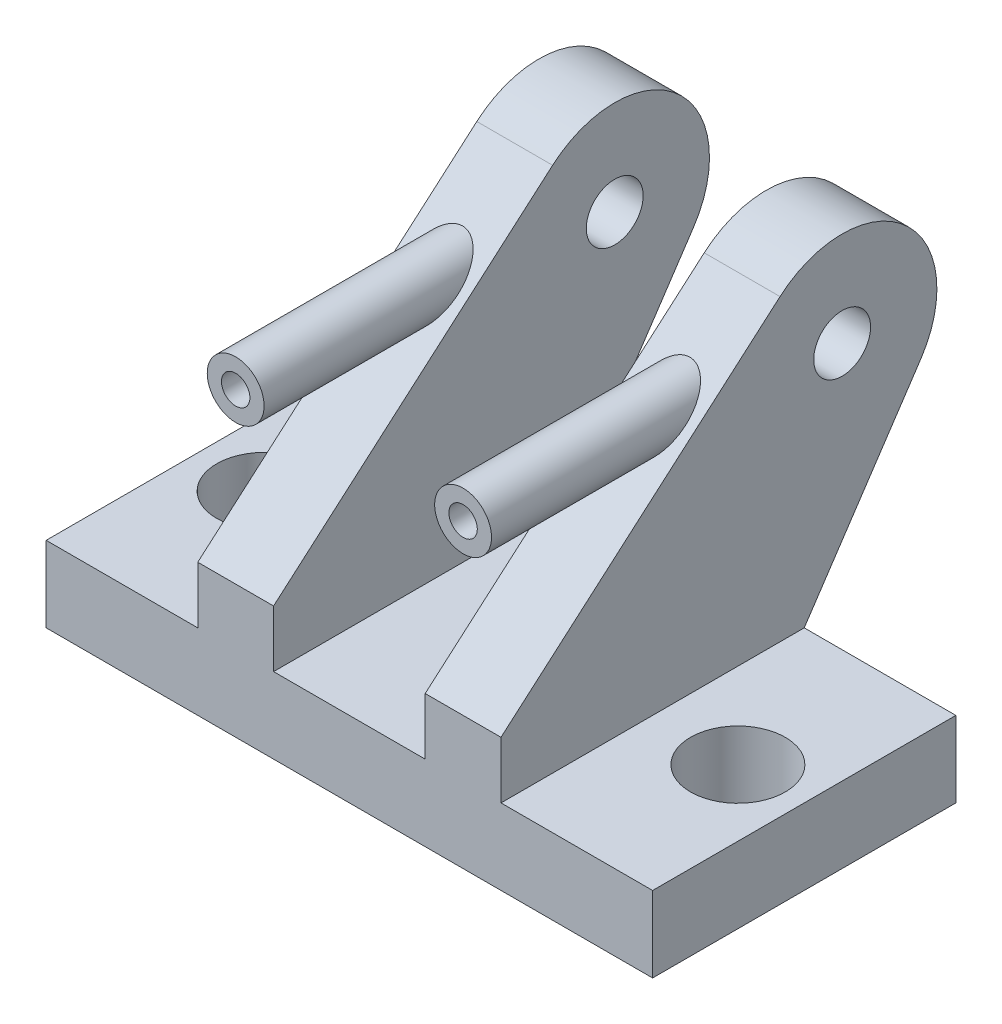
ISO-10303-21;
HEADER;
FILE_DESCRIPTION(('STEP AP214'),'2;1');
FILE_NAME('part.step','',(''),(''),'','','');
FILE_SCHEMA(('AUTOMOTIVE_DESIGN { 1 0 10303 214 1 1 1 1 }'));
ENDSEC;
DATA;
#1=APPLICATION_CONTEXT('core data for automotive mechanical design processes');
#2=APPLICATION_PROTOCOL_DEFINITION('international standard','automotive_design',2000,#1);
#3=PRODUCT_CONTEXT('',#1,'mechanical');
#4=PRODUCT('Part','Part','',(#3));
#5=PRODUCT_RELATED_PRODUCT_CATEGORY('part','',(#4));
#6=PRODUCT_DEFINITION_FORMATION('','',#4);
#7=PRODUCT_DEFINITION_CONTEXT('part definition',#1,'design');
#8=PRODUCT_DEFINITION('design','',#6,#7);
#9=PRODUCT_DEFINITION_SHAPE('','',#8);
#10=(LENGTH_UNIT() NAMED_UNIT(*) SI_UNIT(.MILLI.,.METRE.));
#11=(NAMED_UNIT(*) PLANE_ANGLE_UNIT() SI_UNIT($,.RADIAN.));
#12=(NAMED_UNIT(*) SI_UNIT($,.STERADIAN.) SOLID_ANGLE_UNIT());
#13=UNCERTAINTY_MEASURE_WITH_UNIT(LENGTH_MEASURE(1.E-05),#10,'distance_accuracy_value','');
#14=(GEOMETRIC_REPRESENTATION_CONTEXT(3) GLOBAL_UNCERTAINTY_ASSIGNED_CONTEXT((#13)) GLOBAL_UNIT_ASSIGNED_CONTEXT((#10,
#11,#12)) REPRESENTATION_CONTEXT('',''));
#15=CARTESIAN_POINT('',(0.,0.,0.));
#16=DIRECTION('',(0.,0.,1.));
#17=DIRECTION('',(1.,0.,0.));
#18=AXIS2_PLACEMENT_3D('',#15,#16,#17);
#19=CARTESIAN_POINT('',(-16.,32.,-20.));
#20=DIRECTION('',(1.,0.,0.));
#21=DIRECTION('',(0.,0.,-1.));
#22=AXIS2_PLACEMENT_3D('',#19,#20,#21);
#23=CYLINDRICAL_SURFACE('',#22,3.);
#24=CARTESIAN_POINT('',(-16.,32.,-20.));
#25=DIRECTION('',(1.,0.,0.));
#26=DIRECTION('',(0.,0.,-1.));
#27=AXIS2_PLACEMENT_3D('',#24,#25,#26);
#28=CIRCLE('',#27,3.);
#29=CARTESIAN_POINT('',(-16.,32.,-23.));
#30=VERTEX_POINT('',#29);
#31=EDGE_CURVE('E190',#30,#30,#28,.T.);
#32=ORIENTED_EDGE('',*,*,#31,.F.);
#33=EDGE_LOOP('',(#32));
#34=FACE_BOUND('',#33,.T.);
#35=CARTESIAN_POINT('',(-8.,32.,-20.));
#36=DIRECTION('',(1.,0.,0.));
#37=DIRECTION('',(0.,0.,-1.));
#38=AXIS2_PLACEMENT_3D('',#35,#36,#37);
#39=CIRCLE('',#38,3.);
#40=CARTESIAN_POINT('',(-8.,32.,-23.));
#41=VERTEX_POINT('',#40);
#42=EDGE_CURVE('E288',#41,#41,#39,.T.);
#43=ORIENTED_EDGE('',*,*,#42,.T.);
#44=EDGE_LOOP('',(#43));
#45=FACE_BOUND('',#44,.T.);
#46=CARTESIAN_POINT('',(-10.5,31.7704449033827,-17.0087954838198));
#47=CARTESIAN_POINT('',(-10.5000048111588,31.8478663222095,-17.0028580295699));
#48=CARTESIAN_POINT('',(-10.5060273391963,31.9256007365963,-16.9999427419938));
#49=CARTESIAN_POINT('',(-10.5300670627226,32.0792542082069,-17.0000592171805));
#50=CARTESIAN_POINT('',(-10.5481020623102,32.155170397298,-17.0030998203767));
#51=CARTESIAN_POINT('',(-10.595481887112,32.3027185353823,-17.0143975460524));
#52=CARTESIAN_POINT('',(-10.6247943058734,32.3743620869285,-17.0226397643905));
#53=CARTESIAN_POINT('',(-10.6937531665848,32.5118203804366,-17.043164364668));
#54=CARTESIAN_POINT('',(-10.7333997139456,32.5776350629334,-17.0554467878189));
#55=CARTESIAN_POINT('',(-10.8238857075586,32.7048508174601,-17.0832190609236));
#56=CARTESIAN_POINT('',(-10.8751416069052,32.7659293169323,-17.0988264579663));
#57=CARTESIAN_POINT('',(-10.986505257153,32.8791101689768,-17.1310916451509));
#58=CARTESIAN_POINT('',(-11.0466178866392,32.9312075398989,-17.1477500112916));
#59=CARTESIAN_POINT('',(-11.1793974438675,33.0289828029199,-17.1814767722966));
#60=CARTESIAN_POINT('',(-11.2526739595966,33.0738604978633,-17.1984784174645));
#61=CARTESIAN_POINT('',(-11.4063841024319,33.1506601930828,-17.2291336123782));
#62=CARTESIAN_POINT('',(-11.486815648196,33.182585946049,-17.2427881314642));
#63=CARTESIAN_POINT('',(-11.6505464923198,33.2316053081399,-17.2643364266875));
#64=CARTESIAN_POINT('',(-11.7337177807029,33.2490612430133,-17.2723700890034));
#65=CARTESIAN_POINT('',(-11.9021593481119,33.2696489999433,-17.2818885750492));
#66=CARTESIAN_POINT('',(-11.9874280779958,33.2727910924926,-17.2833780943164));
#67=CARTESIAN_POINT('',(-12.1497859406349,33.2649677334479,-17.2797310432029));
#68=CARTESIAN_POINT('',(-12.2269487290328,33.2551904943836,-17.2751524561731));
#69=CARTESIAN_POINT('',(-12.378402023894,33.223989711037,-17.2609967490716));
#70=CARTESIAN_POINT('',(-12.4526918960177,33.2025636102362,-17.2514185317739));
#71=CARTESIAN_POINT('',(-12.5974211704858,33.1485332051793,-17.2284054097147));
#72=CARTESIAN_POINT('',(-12.6678061246324,33.1158025265947,-17.214927195648));
#73=CARTESIAN_POINT('',(-12.802380189521,33.0401498426781,-17.1857987997305));
#74=CARTESIAN_POINT('',(-12.8665667068665,32.9972235973323,-17.1701477153798));
#75=CARTESIAN_POINT('',(-12.9929458715461,32.8978666193472,-17.1369925351559));
#76=CARTESIAN_POINT('',(-13.0544523693286,32.840573886554,-17.1194475125294));
#77=CARTESIAN_POINT('',(-13.1672692456487,32.716240786258,-17.0860440463706));
#78=CARTESIAN_POINT('',(-13.2185774346183,32.6491983308369,-17.0701859653621));
#79=CARTESIAN_POINT('',(-13.3102817463242,32.5056533965863,-17.0420030055271));
#80=CARTESIAN_POINT('',(-13.3504792863428,32.4290104675863,-17.0297422108769));
#81=CARTESIAN_POINT('',(-13.4172385572043,32.2693498392952,-17.0110386359032));
#82=CARTESIAN_POINT('',(-13.443810637506,32.1863370336231,-17.0045914369284));
#83=CARTESIAN_POINT('',(-13.4806459937187,32.0235834493097,-16.9990780638923));
#84=CARTESIAN_POINT('',(-13.4920527992766,31.9441196254445,-16.9994579860263));
#85=CARTESIAN_POINT('',(-13.5020555795953,31.7846930857811,-17.0066736922358));
#86=CARTESIAN_POINT('',(-13.500654975282,31.7047305089046,-17.0135077519401));
#87=CARTESIAN_POINT('',(-13.4857575032198,31.5509284341147,-17.0328402385209));
#88=CARTESIAN_POINT('',(-13.4728912115522,31.4769863603886,-17.045026793255));
#89=CARTESIAN_POINT('',(-13.4366444018226,31.3327382693359,-17.0742211676912));
#90=CARTESIAN_POINT('',(-13.4132618546571,31.2624329566402,-17.091229917598));
#91=CARTESIAN_POINT('',(-13.3553631467453,31.1231507619428,-17.1300439891382));
#92=CARTESIAN_POINT('',(-13.3203054468814,31.0544595352581,-17.1520616442904));
#93=CARTESIAN_POINT('',(-13.2406359601358,30.9238749551391,-17.1987907584515));
#94=CARTESIAN_POINT('',(-13.1960194802268,30.8619849635373,-17.2235035377356));
#95=CARTESIAN_POINT('',(-13.0925670444801,30.7392017492637,-17.2768831146723));
#96=CARTESIAN_POINT('',(-13.0326857291898,30.6792423151275,-17.3056777223733));
#97=CARTESIAN_POINT('',(-12.9033026718428,30.5699343939376,-17.3620646661374));
#98=CARTESIAN_POINT('',(-12.8337914132717,30.5205965280606,-17.3896557769723));
#99=CARTESIAN_POINT('',(-12.6829952194243,30.4319787876894,-17.4418620732814));
#100=CARTESIAN_POINT('',(-12.601328759867,30.3932320615202,-17.4662947474963));
#101=CARTESIAN_POINT('',(-12.4306103307609,30.3307264558074,-17.5070212480425));
#102=CARTESIAN_POINT('',(-12.3415753345912,30.3069341595524,-17.523333203586));
#103=CARTESIAN_POINT('',(-12.172230909427,30.2782538371052,-17.5432029577608));
#104=CARTESIAN_POINT('',(-12.0924703527432,30.2711665974273,-17.5482392918356));
#105=CARTESIAN_POINT('',(-11.9327993759373,30.2698296360846,-17.5491804754195));
#106=CARTESIAN_POINT('',(-11.8528890452951,30.2755738012185,-17.5450896733251));
#107=CARTESIAN_POINT('',(-11.7060355434161,30.2979010058189,-17.529574442924));
#108=CARTESIAN_POINT('',(-11.6387460638112,30.3129956330201,-17.5191604567186));
#109=CARTESIAN_POINT('',(-11.5077807127443,30.3518581068206,-17.4931748168069));
#110=CARTESIAN_POINT('',(-11.4441061007414,30.3756289551382,-17.4776013782536));
#111=CARTESIAN_POINT('',(-11.3157334770773,30.433587163924,-17.4411678334928));
#112=CARTESIAN_POINT('',(-11.2514807977881,30.4685319538828,-17.41995304452));
#113=CARTESIAN_POINT('',(-11.1293034092184,30.5468598381189,-17.3750384208283));
#114=CARTESIAN_POINT('',(-11.0713823946924,30.5902478186836,-17.3513371507985));
#115=CARTESIAN_POINT('',(-10.9531938223681,30.6927995414072,-17.2990601660759));
#116=CARTESIAN_POINT('',(-10.894221079432,30.7533923590554,-17.2703444155389));
#117=CARTESIAN_POINT('',(-10.7869452211249,30.8840767702519,-17.2143633994414));
#118=CARTESIAN_POINT('',(-10.7386515161409,30.9541766543937,-17.1870994291243));
#119=CARTESIAN_POINT('',(-10.6522948300558,31.1058846200196,-17.1351677931162));
#120=CARTESIAN_POINT('',(-10.6147781453822,31.1878643222564,-17.1106680617289));
#121=CARTESIAN_POINT('',(-10.5548354706436,31.3585843484694,-17.06806155791));
#122=CARTESIAN_POINT('',(-10.5323648467104,31.4473037993593,-17.0499359533889));
#123=CARTESIAN_POINT('',(-10.512135222407,31.5761013815226,-17.029843660117));
#124=CARTESIAN_POINT('',(-10.5075987946117,31.6147057655227,-17.0245880386588));
#125=CARTESIAN_POINT('',(-10.5015298347631,31.6923284354203,-17.0155631040996));
#126=CARTESIAN_POINT('',(-10.4999975703444,31.7313467578835,-17.0117939234463));
#127=CARTESIAN_POINT('',(-10.5,31.7704449033827,-17.0087954838198));
#128=B_SPLINE_CURVE_WITH_KNOTS('',3,(#46,#47,#48,#49,#50,#51,#52,#53,#54,#55,#56,#57,#58,#59,
#60,#61,#62,#63,#64,#65,#66,#67,#68,#69,#70,#71,#72,#73,#74,#75,#76,#77,#78,#79,#80,#81,#82,#83,
#84,#85,#86,#87,#88,#89,#90,#91,#92,#93,#94,#95,#96,#97,#98,#99,#100,#101,#102,#103,#104,#105,
#106,#107,#108,#109,#110,#111,#112,#113,#114,#115,#116,#117,#118,#119,#120,#121,#122,#123,#124,
#125,#126,#127),.UNSPECIFIED.,.T.,.F.,(4,2,2,2,2,2,2,2,2,2,2,2,2,2,2,2,2,2,2,2,2,2,2,2,2,2,2,2,
2,2,2,2,2,2,2,2,2,2,2,2,4),(0.,0.232792148926327,0.465930097182229,0.698403051534686,
0.930878377261991,1.17360439246079,1.41646461267079,1.67797478655208,1.93940913638484,
2.19408048271189,2.44856906801057,2.68120534821702,2.91389270458821,3.14927030892275,
3.38474597128177,3.64118377025843,3.89767656687815,4.15849424666069,4.41911352321119,
4.6586908595553,4.89820420541347,5.12530623089295,5.3524520943483,5.59208892620943,
5.83184368211594,6.09918070021873,6.36678381639534,6.6460699034179,6.92472966659668,
7.16394454301338,7.40304547580341,7.61140703170697,7.81984074304264,8.04746094171442,
8.27521326381293,8.54194259056401,8.80890603120849,9.08766465130132,9.36559263142858,
9.48314318400097,9.60070420842717),.UNSPECIFIED.);
#129=CARTESIAN_POINT('',(-10.5,31.7704449033827,-17.0087954838198));
#130=VERTEX_POINT('',#129);
#131=EDGE_CURVE('E269',#130,#130,#128,.T.);
#132=ORIENTED_EDGE('',*,*,#131,.T.);
#133=EDGE_LOOP('',(#132));
#134=FACE_BOUND('',#133,.T.);
#135=ADVANCED_FACE('F45',(#34,#45,#134),#23,.F.);
#136=CARTESIAN_POINT('',(0.,8.,0.));
#137=DIRECTION('',(0.,1.,0.));
#138=DIRECTION('',(0.,0.,1.));
#139=AXIS2_PLACEMENT_3D('',#136,#137,#138);
#140=PLANE('',#139);
#141=CARTESIAN_POINT('',(-25.,8.,0.));
#142=DIRECTION('',(0.,1.,0.));
#143=DIRECTION('',(0.,0.,1.));
#144=AXIS2_PLACEMENT_3D('',#141,#142,#143);
#145=CIRCLE('',#144,5.);
#146=CARTESIAN_POINT('',(-25.,8.,5.));
#147=VERTEX_POINT('',#146);
#148=EDGE_CURVE('E278',#147,#147,#145,.F.);
#149=ORIENTED_EDGE('',*,*,#148,.T.);
#150=EDGE_LOOP('',(#149));
#151=FACE_BOUND('',#150,.T.);
#152=DIRECTION('',(1.,0.,0.));
#153=VECTOR('',#152,1.);
#154=CARTESIAN_POINT('',(-32.,8.,16.));
#155=LINE('',#154,#153);
#156=CARTESIAN_POINT('',(-32.,8.,16.));
#157=VERTEX_POINT('',#156);
#158=CARTESIAN_POINT('',(-16.,8.,16.));
#159=VERTEX_POINT('',#158);
#160=EDGE_CURVE('E353',#157,#159,#155,.T.);
#161=ORIENTED_EDGE('',*,*,#160,.T.);
#162=DIRECTION('',(0.,0.,-1.));
#163=VECTOR('',#162,1.);
#164=CARTESIAN_POINT('',(-16.,8.,-16.));
#165=LINE('',#164,#163);
#166=CARTESIAN_POINT('',(-16.,8.,-16.));
#167=VERTEX_POINT('',#166);
#168=EDGE_CURVE('E63',#159,#167,#165,.T.);
#169=ORIENTED_EDGE('',*,*,#168,.T.);
#170=DIRECTION('',(-1.,0.,0.));
#171=VECTOR('',#170,1.);
#172=CARTESIAN_POINT('',(-32.,8.,-16.));
#173=LINE('',#172,#171);
#174=CARTESIAN_POINT('',(-32.,8.,-16.));
#175=VERTEX_POINT('',#174);
#176=EDGE_CURVE('E401',#167,#175,#173,.T.);
#177=ORIENTED_EDGE('',*,*,#176,.T.);
#178=DIRECTION('',(0.,0.,1.));
#179=VECTOR('',#178,1.);
#180=CARTESIAN_POINT('',(-32.,8.,-16.));
#181=LINE('',#180,#179);
#182=EDGE_CURVE('E351',#175,#157,#181,.T.);
#183=ORIENTED_EDGE('',*,*,#182,.T.);
#184=EDGE_LOOP('',(#161,#169,#177,#183));
#185=FACE_BOUND('',#184,.T.);
#186=ADVANCED_FACE('F251',(#151,#185),#140,.T.);
#187=DIRECTION('',(0.,0.,-1.));
#188=VECTOR('',#187,1.);
#189=CARTESIAN_POINT('',(-8.,8.,-16.));
#190=LINE('',#189,#188);
#191=CARTESIAN_POINT('',(-8.,8.,16.));
#192=VERTEX_POINT('',#191);
#193=CARTESIAN_POINT('',(-8.,8.,-16.));
#194=VERTEX_POINT('',#193);
#195=EDGE_CURVE('E186',#192,#194,#190,.T.);
#196=ORIENTED_EDGE('',*,*,#195,.F.);
#197=CARTESIAN_POINT('',(8.,8.,16.));
#198=VERTEX_POINT('',#197);
#199=EDGE_CURVE('E350',#192,#198,#155,.T.);
#200=ORIENTED_EDGE('',*,*,#199,.T.);
#201=DIRECTION('',(0.,0.,-1.));
#202=VECTOR('',#201,1.);
#203=CARTESIAN_POINT('',(8.,8.,-16.));
#204=LINE('',#203,#202);
#205=CARTESIAN_POINT('',(8.,8.,-16.));
#206=VERTEX_POINT('',#205);
#207=EDGE_CURVE('E370',#198,#206,#204,.T.);
#208=ORIENTED_EDGE('',*,*,#207,.T.);
#209=EDGE_CURVE('E405',#206,#194,#173,.T.);
#210=ORIENTED_EDGE('',*,*,#209,.T.);
#211=EDGE_LOOP('',(#196,#200,#208,#210));
#212=FACE_BOUND('',#211,.T.);
#213=ADVANCED_FACE('F328',(#212),#140,.T.);
#214=CARTESIAN_POINT('',(32.,8.,-16.));
#215=DIRECTION('',(-1.,0.,0.));
#216=DIRECTION('',(0.,0.,1.));
#217=AXIS2_PLACEMENT_3D('',#214,#215,#216);
#218=PLANE('',#217);
#219=DIRECTION('',(0.,0.,-1.));
#220=VECTOR('',#219,1.);
#221=CARTESIAN_POINT('',(32.,0.,-16.));
#222=LINE('',#221,#220);
#223=CARTESIAN_POINT('',(32.,0.,16.));
#224=VERTEX_POINT('',#223);
#225=CARTESIAN_POINT('',(32.,0.,-16.));
#226=VERTEX_POINT('',#225);
#227=EDGE_CURVE('E397',#224,#226,#222,.T.);
#228=ORIENTED_EDGE('',*,*,#227,.T.);
#229=DIRECTION('',(0.,-1.,0.));
#230=VECTOR('',#229,1.);
#231=CARTESIAN_POINT('',(32.,8.,-16.));
#232=LINE('',#231,#230);
#233=CARTESIAN_POINT('',(32.,8.,-16.));
#234=VERTEX_POINT('',#233);
#235=EDGE_CURVE('E11',#234,#226,#232,.T.);
#236=ORIENTED_EDGE('',*,*,#235,.F.);
#237=DIRECTION('',(0.,0.,-1.));
#238=VECTOR('',#237,1.);
#239=CARTESIAN_POINT('',(32.,8.,-16.));
#240=LINE('',#239,#238);
#241=CARTESIAN_POINT('',(32.,8.,16.));
#242=VERTEX_POINT('',#241);
#243=EDGE_CURVE('E398',#242,#234,#240,.T.);
#244=ORIENTED_EDGE('',*,*,#243,.F.);
#245=DIRECTION('',(0.,-1.,0.));
#246=VECTOR('',#245,1.);
#247=CARTESIAN_POINT('',(32.,8.,16.));
#248=LINE('',#247,#246);
#249=EDGE_CURVE('E347',#242,#224,#248,.T.);
#250=ORIENTED_EDGE('',*,*,#249,.T.);
#251=EDGE_LOOP('',(#228,#236,#244,#250));
#252=FACE_BOUND('',#251,.T.);
#253=ADVANCED_FACE('F47',(#252),#218,.F.);
#254=CARTESIAN_POINT('',(-32.,8.,-16.));
#255=DIRECTION('',(0.,0.,1.));
#256=DIRECTION('',(1.,0.,0.));
#257=AXIS2_PLACEMENT_3D('',#254,#255,#256);
#258=PLANE('',#257);
#259=DIRECTION('',(-1.,0.,0.));
#260=VECTOR('',#259,1.);
#261=CARTESIAN_POINT('',(-32.,0.,-16.));
#262=LINE('',#261,#260);
#263=CARTESIAN_POINT('',(-32.,0.,-16.));
#264=VERTEX_POINT('',#263);
#265=EDGE_CURVE('E412',#226,#264,#262,.T.);
#266=ORIENTED_EDGE('',*,*,#265,.T.);
#267=DIRECTION('',(0.,-1.,0.));
#268=VECTOR('',#267,1.);
#269=CARTESIAN_POINT('',(-32.,8.,-16.));
#270=LINE('',#269,#268);
#271=EDGE_CURVE('E55',#175,#264,#270,.T.);
#272=ORIENTED_EDGE('',*,*,#271,.F.);
#273=ORIENTED_EDGE('',*,*,#176,.F.);
#274=DIRECTION('',(1.,0.,0.));
#275=VECTOR('',#274,1.);
#276=CARTESIAN_POINT('',(-16.,8.,-16.));
#277=LINE('',#276,#275);
#278=EDGE_CURVE('E70',#167,#194,#277,.T.);
#279=ORIENTED_EDGE('',*,*,#278,.T.);
#280=ORIENTED_EDGE('',*,*,#209,.F.);
#281=DIRECTION('',(-1.,0.,0.));
#282=VECTOR('',#281,1.);
#283=CARTESIAN_POINT('',(16.,8.,-16.));
#284=LINE('',#283,#282);
#285=CARTESIAN_POINT('',(16.,8.,-16.));
#286=VERTEX_POINT('',#285);
#287=EDGE_CURVE('E393',#286,#206,#284,.T.);
#288=ORIENTED_EDGE('',*,*,#287,.F.);
#289=EDGE_CURVE('E335',#234,#286,#173,.T.);
#290=ORIENTED_EDGE('',*,*,#289,.F.);
#291=ORIENTED_EDGE('',*,*,#235,.T.);
#292=EDGE_LOOP('',(#266,#272,#273,#279,#280,#288,#290,#291));
#293=FACE_BOUND('',#292,.T.);
#294=ADVANCED_FACE('F439',(#293),#258,.F.);
#295=CARTESIAN_POINT('',(-32.,8.,-16.));
#296=DIRECTION('',(1.,0.,0.));
#297=DIRECTION('',(0.,0.,-1.));
#298=AXIS2_PLACEMENT_3D('',#295,#296,#297);
#299=PLANE('',#298);
#300=DIRECTION('',(0.,0.,1.));
#301=VECTOR('',#300,1.);
#302=CARTESIAN_POINT('',(-32.,0.,-16.));
#303=LINE('',#302,#301);
#304=CARTESIAN_POINT('',(-32.,0.,16.));
#305=VERTEX_POINT('',#304);
#306=EDGE_CURVE('E415',#264,#305,#303,.T.);
#307=ORIENTED_EDGE('',*,*,#306,.T.);
#308=DIRECTION('',(0.,-1.,0.));
#309=VECTOR('',#308,1.);
#310=CARTESIAN_POINT('',(-32.,8.,16.));
#311=LINE('',#310,#309);
#312=EDGE_CURVE('E422',#157,#305,#311,.T.);
#313=ORIENTED_EDGE('',*,*,#312,.F.);
#314=ORIENTED_EDGE('',*,*,#182,.F.);
#315=ORIENTED_EDGE('',*,*,#271,.T.);
#316=EDGE_LOOP('',(#307,#313,#314,#315));
#317=FACE_BOUND('',#316,.T.);
#318=ADVANCED_FACE('F432',(#317),#299,.F.);
#319=CARTESIAN_POINT('',(-32.,8.,16.));
#320=DIRECTION('',(0.,0.,-1.));
#321=DIRECTION('',(-1.,0.,0.));
#322=AXIS2_PLACEMENT_3D('',#319,#320,#321);
#323=PLANE('',#322);
#324=DIRECTION('',(1.,0.,0.));
#325=VECTOR('',#324,1.);
#326=CARTESIAN_POINT('',(-32.,0.,16.));
#327=LINE('',#326,#325);
#328=EDGE_CURVE('E402',#305,#224,#327,.T.);
#329=ORIENTED_EDGE('',*,*,#328,.T.);
#330=ORIENTED_EDGE('',*,*,#249,.F.);
#331=CARTESIAN_POINT('',(16.,8.,16.));
#332=VERTEX_POINT('',#331);
#333=EDGE_CURVE('E333',#332,#242,#155,.T.);
#334=ORIENTED_EDGE('',*,*,#333,.F.);
#335=DIRECTION('',(0.,-1.,0.));
#336=VECTOR('',#335,1.);
#337=CARTESIAN_POINT('',(16.,8.,16.));
#338=LINE('',#337,#336);
#339=CARTESIAN_POINT('',(16.,14.,16.));
#340=VERTEX_POINT('',#339);
#341=EDGE_CURVE('E345',#340,#332,#338,.T.);
#342=ORIENTED_EDGE('',*,*,#341,.F.);
#343=DIRECTION('',(-1.,0.,0.));
#344=VECTOR('',#343,1.);
#345=CARTESIAN_POINT('',(16.,14.,16.));
#346=LINE('',#345,#344);
#347=CARTESIAN_POINT('',(8.,14.,16.));
#348=VERTEX_POINT('',#347);
#349=EDGE_CURVE('E360',#340,#348,#346,.T.);
#350=ORIENTED_EDGE('',*,*,#349,.T.);
#351=DIRECTION('',(0.,-1.,0.));
#352=VECTOR('',#351,1.);
#353=CARTESIAN_POINT('',(8.,8.,16.));
#354=LINE('',#353,#352);
#355=EDGE_CURVE('E341',#348,#198,#354,.T.);
#356=ORIENTED_EDGE('',*,*,#355,.T.);
#357=ORIENTED_EDGE('',*,*,#199,.F.);
#358=DIRECTION('',(0.,-1.,0.));
#359=VECTOR('',#358,1.);
#360=CARTESIAN_POINT('',(-8.,8.,16.));
#361=LINE('',#360,#359);
#362=CARTESIAN_POINT('',(-8.,14.,16.));
#363=VERTEX_POINT('',#362);
#364=EDGE_CURVE('E156',#363,#192,#361,.T.);
#365=ORIENTED_EDGE('',*,*,#364,.F.);
#366=DIRECTION('',(1.,0.,0.));
#367=VECTOR('',#366,1.);
#368=CARTESIAN_POINT('',(-16.,14.,16.));
#369=LINE('',#368,#367);
#370=CARTESIAN_POINT('',(-16.,14.,16.));
#371=VERTEX_POINT('',#370);
#372=EDGE_CURVE('E150',#371,#363,#369,.T.);
#373=ORIENTED_EDGE('',*,*,#372,.F.);
#374=DIRECTION('',(0.,-1.,0.));
#375=VECTOR('',#374,1.);
#376=CARTESIAN_POINT('',(-16.,8.,16.));
#377=LINE('',#376,#375);
#378=EDGE_CURVE('E154',#371,#159,#377,.T.);
#379=ORIENTED_EDGE('',*,*,#378,.T.);
#380=ORIENTED_EDGE('',*,*,#160,.F.);
#381=ORIENTED_EDGE('',*,*,#312,.T.);
#382=EDGE_LOOP('',(#329,#330,#334,#342,#350,#356,#357,#365,#373,#379,#380,#381));
#383=FACE_BOUND('',#382,.T.);
#384=ADVANCED_FACE('F152',(#383),#323,.F.);
#385=CARTESIAN_POINT('',(25.,8.,0.));
#386=DIRECTION('',(0.,1.,0.));
#387=DIRECTION('',(0.,0.,1.));
#388=AXIS2_PLACEMENT_3D('',#385,#386,#387);
#389=CIRCLE('',#388,5.);
#390=CARTESIAN_POINT('',(25.,8.,5.));
#391=VERTEX_POINT('',#390);
#392=EDGE_CURVE('E303',#391,#391,#389,.T.);
#393=ORIENTED_EDGE('',*,*,#392,.F.);
#394=EDGE_LOOP('',(#393));
#395=FACE_BOUND('',#394,.T.);
#396=DIRECTION('',(0.,0.,-1.));
#397=VECTOR('',#396,1.);
#398=CARTESIAN_POINT('',(16.,8.,-16.));
#399=LINE('',#398,#397);
#400=EDGE_CURVE('E330',#332,#286,#399,.T.);
#401=ORIENTED_EDGE('',*,*,#400,.F.);
#402=ORIENTED_EDGE('',*,*,#333,.T.);
#403=ORIENTED_EDGE('',*,*,#243,.T.);
#404=ORIENTED_EDGE('',*,*,#289,.T.);
#405=EDGE_LOOP('',(#401,#402,#403,#404));
#406=FACE_BOUND('',#405,.T.);
#407=ADVANCED_FACE('F324',(#395,#406),#140,.T.);
#408=CARTESIAN_POINT('',(0.,0.,0.));
#409=DIRECTION('',(0.,1.,0.));
#410=DIRECTION('',(0.,0.,1.));
#411=AXIS2_PLACEMENT_3D('',#408,#409,#410);
#412=PLANE('',#411);
#413=CARTESIAN_POINT('',(25.,0.,0.));
#414=DIRECTION('',(0.,1.,0.));
#415=DIRECTION('',(0.,0.,1.));
#416=AXIS2_PLACEMENT_3D('',#413,#414,#415);
#417=CIRCLE('',#416,5.);
#418=CARTESIAN_POINT('',(25.,0.,5.));
#419=VERTEX_POINT('',#418);
#420=EDGE_CURVE('E49',#419,#419,#417,.T.);
#421=ORIENTED_EDGE('',*,*,#420,.T.);
#422=EDGE_LOOP('',(#421));
#423=FACE_BOUND('',#422,.T.);
#424=CARTESIAN_POINT('',(-25.,0.,0.));
#425=DIRECTION('',(0.,1.,0.));
#426=DIRECTION('',(0.,0.,1.));
#427=AXIS2_PLACEMENT_3D('',#424,#425,#426);
#428=CIRCLE('',#427,5.);
#429=CARTESIAN_POINT('',(-25.,0.,5.));
#430=VERTEX_POINT('',#429);
#431=EDGE_CURVE('E300',#430,#430,#428,.F.);
#432=ORIENTED_EDGE('',*,*,#431,.F.);
#433=EDGE_LOOP('',(#432));
#434=FACE_BOUND('',#433,.T.);
#435=ORIENTED_EDGE('',*,*,#227,.F.);
#436=ORIENTED_EDGE('',*,*,#328,.F.);
#437=ORIENTED_EDGE('',*,*,#306,.F.);
#438=ORIENTED_EDGE('',*,*,#265,.F.);
#439=EDGE_LOOP('',(#435,#436,#437,#438));
#440=FACE_BOUND('',#439,.T.);
#441=ADVANCED_FACE('F310',(#423,#434,#440),#412,.F.);
#442=CARTESIAN_POINT('',(16.,32.,-20.));
#443=DIRECTION('',(-1.,0.,0.));
#444=DIRECTION('',(0.,0.,1.));
#445=AXIS2_PLACEMENT_3D('',#442,#443,#444);
#446=PLANE('',#445);
#447=ORIENTED_EDGE('',*,*,#400,.T.);
#448=DIRECTION('',(0.,0.831665122141305,-0.555277520356883));
#449=VECTOR('',#448,1.);
#450=CARTESIAN_POINT('',(16.,26.4472247964312,-28.316651221413));
#451=LINE('',#450,#449);
#452=CARTESIAN_POINT('',(16.,26.4472247964312,-28.316651221413));
#453=VERTEX_POINT('',#452);
#454=EDGE_CURVE('E340',#286,#453,#451,.T.);
#455=ORIENTED_EDGE('',*,*,#454,.T.);
#456=CARTESIAN_POINT('',(16.,32.,-20.));
#457=DIRECTION('',(1.,0.,0.));
#458=DIRECTION('',(0.,0.,1.));
#459=AXIS2_PLACEMENT_3D('',#456,#457,#458);
#460=CIRCLE('',#459,10.);
#461=CARTESIAN_POINT('',(16.,39.5527060842746,-13.4458691800849));
#462=VERTEX_POINT('',#461);
#463=EDGE_CURVE('E366',#453,#462,#460,.T.);
#464=ORIENTED_EDGE('',*,*,#463,.T.);
#465=DIRECTION('',(0.,-0.65541308199151,0.755270608427463));
#466=VECTOR('',#465,1.);
#467=CARTESIAN_POINT('',(16.,14.,16.));
#468=LINE('',#467,#466);
#469=EDGE_CURVE('E357',#462,#340,#468,.T.);
#470=ORIENTED_EDGE('',*,*,#469,.T.);
#471=ORIENTED_EDGE('',*,*,#341,.T.);
#472=EDGE_LOOP('',(#447,#455,#464,#470,#471));
#473=FACE_BOUND('',#472,.T.);
#474=CARTESIAN_POINT('',(16.,32.,-20.));
#475=DIRECTION('',(1.,0.,0.));
#476=DIRECTION('',(0.,0.,-1.));
#477=AXIS2_PLACEMENT_3D('',#474,#475,#476);
#478=CIRCLE('',#477,3.);
#479=CARTESIAN_POINT('',(16.,32.,-23.));
#480=VERTEX_POINT('',#479);
#481=EDGE_CURVE('E374',#480,#480,#478,.T.);
#482=ORIENTED_EDGE('',*,*,#481,.F.);
#483=EDGE_LOOP('',(#482));
#484=FACE_BOUND('',#483,.T.);
#485=ADVANCED_FACE('F354',(#473,#484),#446,.F.);
#486=CARTESIAN_POINT('',(8.,32.,-20.));
#487=DIRECTION('',(-1.,0.,0.));
#488=DIRECTION('',(0.,0.,1.));
#489=AXIS2_PLACEMENT_3D('',#486,#487,#488);
#490=PLANE('',#489);
#491=ORIENTED_EDGE('',*,*,#207,.F.);
#492=ORIENTED_EDGE('',*,*,#355,.F.);
#493=DIRECTION('',(0.,-0.65541308199151,0.755270608427463));
#494=VECTOR('',#493,1.);
#495=CARTESIAN_POINT('',(8.,14.,16.));
#496=LINE('',#495,#494);
#497=CARTESIAN_POINT('',(8.,39.5527060842746,-13.4458691800849));
#498=VERTEX_POINT('',#497);
#499=EDGE_CURVE('E380',#498,#348,#496,.T.);
#500=ORIENTED_EDGE('',*,*,#499,.F.);
#501=CARTESIAN_POINT('',(8.,32.,-20.));
#502=DIRECTION('',(1.,0.,0.));
#503=DIRECTION('',(0.,0.,1.));
#504=AXIS2_PLACEMENT_3D('',#501,#502,#503);
#505=CIRCLE('',#504,10.);
#506=CARTESIAN_POINT('',(8.,26.4472247964312,-28.316651221413));
#507=VERTEX_POINT('',#506);
#508=EDGE_CURVE('E377',#507,#498,#505,.T.);
#509=ORIENTED_EDGE('',*,*,#508,.F.);
#510=DIRECTION('',(0.,0.831665122141305,-0.555277520356883));
#511=VECTOR('',#510,1.);
#512=CARTESIAN_POINT('',(8.,26.4472247964312,-28.316651221413));
#513=LINE('',#512,#511);
#514=EDGE_CURVE('E373',#206,#507,#513,.T.);
#515=ORIENTED_EDGE('',*,*,#514,.F.);
#516=EDGE_LOOP('',(#491,#492,#500,#509,#515));
#517=FACE_BOUND('',#516,.T.);
#518=CARTESIAN_POINT('',(8.,32.,-20.));
#519=DIRECTION('',(1.,0.,0.));
#520=DIRECTION('',(0.,0.,-1.));
#521=AXIS2_PLACEMENT_3D('',#518,#519,#520);
#522=CIRCLE('',#521,3.);
#523=CARTESIAN_POINT('',(8.,32.,-23.));
#524=VERTEX_POINT('',#523);
#525=EDGE_CURVE('E450',#524,#524,#522,.T.);
#526=ORIENTED_EDGE('',*,*,#525,.T.);
#527=EDGE_LOOP('',(#526));
#528=FACE_BOUND('',#527,.T.);
#529=ADVANCED_FACE('F485',(#517,#528),#490,.T.);
#530=CARTESIAN_POINT('',(16.,26.4472247964312,-28.316651221413));
#531=DIRECTION('',(0.,0.555277520356883,0.831665122141305));
#532=DIRECTION('',(0.,-0.831665122141305,0.555277520356883));
#533=AXIS2_PLACEMENT_3D('',#530,#531,#532);
#534=PLANE('',#533);
#535=ORIENTED_EDGE('',*,*,#514,.T.);
#536=DIRECTION('',(-1.,0.,0.));
#537=VECTOR('',#536,1.);
#538=CARTESIAN_POINT('',(16.,26.4472247964312,-28.316651221413));
#539=LINE('',#538,#537);
#540=EDGE_CURVE('E389',#453,#507,#539,.T.);
#541=ORIENTED_EDGE('',*,*,#540,.F.);
#542=ORIENTED_EDGE('',*,*,#454,.F.);
#543=ORIENTED_EDGE('',*,*,#287,.T.);
#544=EDGE_LOOP('',(#535,#541,#542,#543));
#545=FACE_BOUND('',#544,.T.);
#546=ADVANCED_FACE('F444',(#545),#534,.F.);
#547=CARTESIAN_POINT('',(16.,32.,-20.));
#548=DIRECTION('',(-1.,0.,0.));
#549=DIRECTION('',(0.,0.,1.));
#550=AXIS2_PLACEMENT_3D('',#547,#548,#549);
#551=CYLINDRICAL_SURFACE('',#550,10.);
#552=ORIENTED_EDGE('',*,*,#508,.T.);
#553=DIRECTION('',(-1.,0.,0.));
#554=VECTOR('',#553,1.);
#555=CARTESIAN_POINT('',(16.,39.5527060842746,-13.4458691800849));
#556=LINE('',#555,#554);
#557=EDGE_CURVE('E364',#462,#498,#556,.T.);
#558=ORIENTED_EDGE('',*,*,#557,.F.);
#559=ORIENTED_EDGE('',*,*,#463,.F.);
#560=ORIENTED_EDGE('',*,*,#540,.T.);
#561=EDGE_LOOP('',(#552,#558,#559,#560));
#562=FACE_BOUND('',#561,.T.);
#563=ADVANCED_FACE('F490',(#562),#551,.T.);
#564=CARTESIAN_POINT('',(16.,14.,16.));
#565=DIRECTION('',(0.,-0.755270608427463,-0.65541308199151));
#566=DIRECTION('',(0.,0.65541308199151,-0.755270608427463));
#567=AXIS2_PLACEMENT_3D('',#564,#565,#566);
#568=PLANE('',#567);
#569=CARTESIAN_POINT('',(12.,31.7704449033827,-4.47791706174467));
#570=DIRECTION('',(0.,-0.755270608427463,-0.65541308199151));
#571=DIRECTION('',(0.,-0.65541308199151,0.755270608427463));
#572=AXIS2_PLACEMENT_3D('',#569,#570,#571);
#573=ELLIPSE('',#572,4.5772659753515,3.);
#574=CARTESIAN_POINT('',(12.,28.7704449033827,-1.02084260360662));
#575=VERTEX_POINT('',#574);
#576=EDGE_CURVE('E454',#575,#575,#573,.F.);
#577=ORIENTED_EDGE('',*,*,#576,.F.);
#578=EDGE_LOOP('',(#577));
#579=FACE_BOUND('',#578,.T.);
#580=ORIENTED_EDGE('',*,*,#499,.T.);
#581=ORIENTED_EDGE('',*,*,#349,.F.);
#582=ORIENTED_EDGE('',*,*,#469,.F.);
#583=ORIENTED_EDGE('',*,*,#557,.T.);
#584=EDGE_LOOP('',(#580,#581,#582,#583));
#585=FACE_BOUND('',#584,.T.);
#586=ADVANCED_FACE('F481',(#579,#585),#568,.F.);
#587=CARTESIAN_POINT('',(16.,32.,-20.));
#588=DIRECTION('',(-1.,0.,0.));
#589=DIRECTION('',(0.,0.,1.));
#590=AXIS2_PLACEMENT_3D('',#587,#588,#589);
#591=CYLINDRICAL_SURFACE('',#590,3.);
#592=CARTESIAN_POINT('',(13.5,31.7704449033827,-17.0087954838198));
#593=CARTESIAN_POINT('',(13.4999951888412,31.8478663222095,-17.0028580295699));
#594=CARTESIAN_POINT('',(13.4939726608037,31.9256007365963,-16.9999427419938));
#595=CARTESIAN_POINT('',(13.4699329372774,32.0792542082069,-17.0000592171805));
#596=CARTESIAN_POINT('',(13.4518979376898,32.155170397298,-17.0030998203767));
#597=CARTESIAN_POINT('',(13.404518112888,32.3027185353823,-17.0143975460524));
#598=CARTESIAN_POINT('',(13.3752056941266,32.3743620869285,-17.0226397643905));
#599=CARTESIAN_POINT('',(13.3062468334152,32.5118203804366,-17.043164364668));
#600=CARTESIAN_POINT('',(13.2666002860544,32.5776350629334,-17.0554467878189));
#601=CARTESIAN_POINT('',(13.1761142924414,32.7048508174601,-17.0832190609236));
#602=CARTESIAN_POINT('',(13.1248583930948,32.7659293169323,-17.0988264579663));
#603=CARTESIAN_POINT('',(13.013494742847,32.8791101689768,-17.1310916451509));
#604=CARTESIAN_POINT('',(12.9533821133608,32.9312075398989,-17.1477500112916));
#605=CARTESIAN_POINT('',(12.8206025561325,33.0289828029199,-17.1814767722966));
#606=CARTESIAN_POINT('',(12.7473260404034,33.0738604978633,-17.1984784174645));
#607=CARTESIAN_POINT('',(12.5936158975681,33.1506601930828,-17.2291336123782));
#608=CARTESIAN_POINT('',(12.513184351804,33.182585946049,-17.2427881314642));
#609=CARTESIAN_POINT('',(12.3494535076802,33.2316053081399,-17.2643364266875));
#610=CARTESIAN_POINT('',(12.2662822192971,33.2490612430133,-17.2723700890034));
#611=CARTESIAN_POINT('',(12.0978406518881,33.2696489999433,-17.2818885750492));
#612=CARTESIAN_POINT('',(12.0125719220042,33.2727910924926,-17.2833780943164));
#613=CARTESIAN_POINT('',(11.8502140593651,33.2649677334479,-17.2797310432029));
#614=CARTESIAN_POINT('',(11.7730512709672,33.2551904943836,-17.2751524561731));
#615=CARTESIAN_POINT('',(11.621597976106,33.223989711037,-17.2609967490716));
#616=CARTESIAN_POINT('',(11.5473081039823,33.2025636102362,-17.2514185317739));
#617=CARTESIAN_POINT('',(11.4025788295142,33.1485332051793,-17.2284054097147));
#618=CARTESIAN_POINT('',(11.3321938753676,33.1158025265947,-17.214927195648));
#619=CARTESIAN_POINT('',(11.197619810479,33.0401498426781,-17.1857987997305));
#620=CARTESIAN_POINT('',(11.1334332931335,32.9972235973323,-17.1701477153798));
#621=CARTESIAN_POINT('',(11.0070541284539,32.8978666193472,-17.1369925351559));
#622=CARTESIAN_POINT('',(10.9455476306714,32.840573886554,-17.1194475125294));
#623=CARTESIAN_POINT('',(10.8327307543513,32.716240786258,-17.0860440463706));
#624=CARTESIAN_POINT('',(10.7814225653817,32.6491983308369,-17.0701859653621));
#625=CARTESIAN_POINT('',(10.6897182536758,32.5056533965863,-17.0420030055271));
#626=CARTESIAN_POINT('',(10.6495207136572,32.4290104675863,-17.0297422108769));
#627=CARTESIAN_POINT('',(10.5827614427957,32.2693498392952,-17.0110386359032));
#628=CARTESIAN_POINT('',(10.556189362494,32.1863370336231,-17.0045914369284));
#629=CARTESIAN_POINT('',(10.5193540062813,32.0235834493097,-16.9990780638923));
#630=CARTESIAN_POINT('',(10.5079472007234,31.9441196254445,-16.9994579860263));
#631=CARTESIAN_POINT('',(10.4979444204047,31.7846930857811,-17.0066736922358));
#632=CARTESIAN_POINT('',(10.499345024718,31.7047305089046,-17.0135077519401));
#633=CARTESIAN_POINT('',(10.5142424967802,31.5509284341147,-17.0328402385209));
#634=CARTESIAN_POINT('',(10.5271087884478,31.4769863603886,-17.045026793255));
#635=CARTESIAN_POINT('',(10.5633555981774,31.3327382693359,-17.0742211676912));
#636=CARTESIAN_POINT('',(10.5867381453429,31.2624329566402,-17.091229917598));
#637=CARTESIAN_POINT('',(10.6446368532547,31.1231507619428,-17.1300439891382));
#638=CARTESIAN_POINT('',(10.6796945531186,31.0544595352581,-17.1520616442904));
#639=CARTESIAN_POINT('',(10.7593640398642,30.9238749551391,-17.1987907584515));
#640=CARTESIAN_POINT('',(10.8039805197732,30.8619849635373,-17.2235035377356));
#641=CARTESIAN_POINT('',(10.9074329555199,30.7392017492637,-17.2768831146723));
#642=CARTESIAN_POINT('',(10.9673142708102,30.6792423151275,-17.3056777223733));
#643=CARTESIAN_POINT('',(11.0966973281572,30.5699343939376,-17.3620646661374));
#644=CARTESIAN_POINT('',(11.1662085867283,30.5205965280606,-17.3896557769723));
#645=CARTESIAN_POINT('',(11.3170047805757,30.4319787876894,-17.4418620732814));
#646=CARTESIAN_POINT('',(11.398671240133,30.3932320615202,-17.4662947474963));
#647=CARTESIAN_POINT('',(11.5693896692391,30.3307264558074,-17.5070212480425));
#648=CARTESIAN_POINT('',(11.6584246654088,30.3069341595524,-17.523333203586));
#649=CARTESIAN_POINT('',(11.827769090573,30.2782538371052,-17.5432029577608));
#650=CARTESIAN_POINT('',(11.9075296472568,30.2711665974273,-17.5482392918356));
#651=CARTESIAN_POINT('',(12.0672006240627,30.2698296360846,-17.5491804754195));
#652=CARTESIAN_POINT('',(12.1471109547049,30.2755738012185,-17.5450896733251));
#653=CARTESIAN_POINT('',(12.2939644565839,30.2979010058189,-17.529574442924));
#654=CARTESIAN_POINT('',(12.3612539361888,30.3129956330201,-17.5191604567186));
#655=CARTESIAN_POINT('',(12.4922192872557,30.3518581068206,-17.4931748168069));
#656=CARTESIAN_POINT('',(12.5558938992586,30.3756289551382,-17.4776013782536));
#657=CARTESIAN_POINT('',(12.6842665229227,30.433587163924,-17.4411678334928));
#658=CARTESIAN_POINT('',(12.7485192022119,30.4685319538828,-17.41995304452));
#659=CARTESIAN_POINT('',(12.8706965907816,30.5468598381189,-17.3750384208283));
#660=CARTESIAN_POINT('',(12.9286176053076,30.5902478186836,-17.3513371507985));
#661=CARTESIAN_POINT('',(13.0468061776319,30.6927995414072,-17.2990601660759));
#662=CARTESIAN_POINT('',(13.105778920568,30.7533923590554,-17.2703444155389));
#663=CARTESIAN_POINT('',(13.2130547788751,30.8840767702519,-17.2143633994414));
#664=CARTESIAN_POINT('',(13.2613484838591,30.9541766543937,-17.1870994291243));
#665=CARTESIAN_POINT('',(13.3477051699442,31.1058846200196,-17.1351677931162));
#666=CARTESIAN_POINT('',(13.3852218546178,31.1878643222564,-17.1106680617289));
#667=CARTESIAN_POINT('',(13.4451645293564,31.3585843484694,-17.06806155791));
#668=CARTESIAN_POINT('',(13.4676351532896,31.4473037993593,-17.0499359533889));
#669=CARTESIAN_POINT('',(13.487864777593,31.5761013815226,-17.029843660117));
#670=CARTESIAN_POINT('',(13.4924012053883,31.6147057655227,-17.0245880386588));
#671=CARTESIAN_POINT('',(13.4984701652369,31.6923284354203,-17.0155631040996));
#672=CARTESIAN_POINT('',(13.5000024296556,31.7313467578835,-17.0117939234463));
#673=CARTESIAN_POINT('',(13.5,31.7704449033827,-17.0087954838198));
#674=B_SPLINE_CURVE_WITH_KNOTS('',3,(#592,#593,#594,#595,#596,#597,#598,#599,#600,#601,#602,
#603,#604,#605,#606,#607,#608,#609,#610,#611,#612,#613,#614,#615,#616,#617,#618,#619,#620,#621,
#622,#623,#624,#625,#626,#627,#628,#629,#630,#631,#632,#633,#634,#635,#636,#637,#638,#639,#640,
#641,#642,#643,#644,#645,#646,#647,#648,#649,#650,#651,#652,#653,#654,#655,#656,#657,#658,#659,
#660,#661,#662,#663,#664,#665,#666,#667,#668,#669,#670,#671,#672,#673),.UNSPECIFIED.,.T.,.F.,(4,
2,2,2,2,2,2,2,2,2,2,2,2,2,2,2,2,2,2,2,2,2,2,2,2,2,2,2,2,2,2,2,2,2,2,2,2,2,2,2,4),(0.,
0.232792148926327,0.465930097182229,0.698403051534686,0.930878377261991,1.17360439246079,
1.41646461267079,1.67797478655209,1.93940913638484,2.19408048271189,2.44856906801057,
2.68120534821702,2.91389270458821,3.14927030892275,3.38474597128177,3.64118377025843,
3.89767656687815,4.15849424666069,4.41911352321119,4.6586908595553,4.89820420541347,
5.12530623089295,5.3524520943483,5.59208892620943,5.83184368211594,6.09918070021873,
6.36678381639534,6.64606990341791,6.92472966659668,7.16394454301338,7.40304547580341,
7.61140703170698,7.81984074304265,8.04746094171442,8.27521326381293,8.54194259056401,
8.80890603120849,9.08766465130132,9.36559263142858,9.48314318400097,9.60070420842717),.UNSPECIFIED.);
#675=CARTESIAN_POINT('',(13.5,31.7704449033827,-17.0087954838198));
#676=VERTEX_POINT('',#675);
#677=EDGE_CURVE('E162',#676,#676,#674,.T.);
#678=ORIENTED_EDGE('',*,*,#677,.T.);
#679=EDGE_LOOP('',(#678));
#680=FACE_BOUND('',#679,.T.);
#681=ORIENTED_EDGE('',*,*,#481,.T.);
#682=EDGE_LOOP('',(#681));
#683=FACE_BOUND('',#682,.T.);
#684=ORIENTED_EDGE('',*,*,#525,.F.);
#685=EDGE_LOOP('',(#684));
#686=FACE_BOUND('',#685,.T.);
#687=ADVANCED_FACE('F477',(#680,#683,#686),#591,.F.);
#688=CARTESIAN_POINT('',(12.,31.7704449033827,16.));
#689=DIRECTION('',(0.,0.,1.));
#690=DIRECTION('',(1.,0.,0.));
#691=AXIS2_PLACEMENT_3D('',#688,#689,#690);
#692=PLANE('',#691);
#693=CARTESIAN_POINT('',(12.,31.7704449033827,16.));
#694=DIRECTION('',(0.,0.,1.));
#695=DIRECTION('',(1.,0.,0.));
#696=AXIS2_PLACEMENT_3D('',#693,#694,#695);
#697=CIRCLE('',#696,1.5);
#698=CARTESIAN_POINT('',(13.5,31.7704449033827,16.));
#699=VERTEX_POINT('',#698);
#700=EDGE_CURVE('E211',#699,#699,#697,.T.);
#701=ORIENTED_EDGE('',*,*,#700,.F.);
#702=EDGE_LOOP('',(#701));
#703=FACE_BOUND('',#702,.T.);
#704=CARTESIAN_POINT('',(12.,31.7704449033827,16.));
#705=DIRECTION('',(0.,0.,1.));
#706=DIRECTION('',(1.,0.,0.));
#707=AXIS2_PLACEMENT_3D('',#704,#705,#706);
#708=CIRCLE('',#707,3.);
#709=CARTESIAN_POINT('',(15.,31.7704449033827,16.));
#710=VERTEX_POINT('',#709);
#711=EDGE_CURVE('E215',#710,#710,#708,.T.);
#712=ORIENTED_EDGE('',*,*,#711,.T.);
#713=EDGE_LOOP('',(#712));
#714=FACE_BOUND('',#713,.T.);
#715=ADVANCED_FACE('F465',(#703,#714),#692,.T.);
#716=CARTESIAN_POINT('',(12.,31.7704449033827,-15.193789369795));
#717=DIRECTION('',(0.,0.,1.));
#718=DIRECTION('',(1.,0.,0.));
#719=AXIS2_PLACEMENT_3D('',#716,#717,#718);
#720=CYLINDRICAL_SURFACE('',#719,3.);
#721=ORIENTED_EDGE('',*,*,#711,.F.);
#722=EDGE_LOOP('',(#721));
#723=FACE_BOUND('',#722,.T.);
#724=ORIENTED_EDGE('',*,*,#576,.T.);
#725=EDGE_LOOP('',(#724));
#726=FACE_BOUND('',#725,.T.);
#727=ADVANCED_FACE('F467',(#723,#726),#720,.T.);
#728=CARTESIAN_POINT('',(12.,31.7704449033827,-30.001));
#729=DIRECTION('',(0.,0.,1.));
#730=DIRECTION('',(1.,0.,0.));
#731=AXIS2_PLACEMENT_3D('',#728,#729,#730);
#732=CYLINDRICAL_SURFACE('',#731,1.5);
#733=ORIENTED_EDGE('',*,*,#677,.F.);
#734=EDGE_LOOP('',(#733));
#735=FACE_BOUND('',#734,.T.);
#736=ORIENTED_EDGE('',*,*,#700,.T.);
#737=EDGE_LOOP('',(#736));
#738=FACE_BOUND('',#737,.T.);
#739=ADVANCED_FACE('F225',(#735,#738),#732,.F.);
#740=CARTESIAN_POINT('',(-16.,14.,16.));
#741=DIRECTION('',(0.,0.755270608427463,0.65541308199151));
#742=DIRECTION('',(0.,-0.65541308199151,0.755270608427463));
#743=AXIS2_PLACEMENT_3D('',#740,#741,#742);
#744=PLANE('',#743);
#745=CARTESIAN_POINT('',(-12.,31.7704449033827,-4.47791706174467));
#746=DIRECTION('',(0.,-0.755270608427463,-0.65541308199151));
#747=DIRECTION('',(0.,-0.65541308199151,0.755270608427463));
#748=AXIS2_PLACEMENT_3D('',#745,#746,#747);
#749=ELLIPSE('',#748,4.5772659753515,3.);
#750=CARTESIAN_POINT('',(-12.,28.7704449033827,-1.02084260360662));
#751=VERTEX_POINT('',#750);
#752=EDGE_CURVE('E284',#751,#751,#749,.T.);
#753=ORIENTED_EDGE('',*,*,#752,.T.);
#754=EDGE_LOOP('',(#753));
#755=FACE_BOUND('',#754,.T.);
#756=DIRECTION('',(0.,-0.65541308199151,0.755270608427463));
#757=VECTOR('',#756,1.);
#758=CARTESIAN_POINT('',(-8.,14.,16.));
#759=LINE('',#758,#757);
#760=CARTESIAN_POINT('',(-8.,39.5527060842746,-13.4458691800849));
#761=VERTEX_POINT('',#760);
#762=EDGE_CURVE('E193',#761,#363,#759,.T.);
#763=ORIENTED_EDGE('',*,*,#762,.F.);
#764=DIRECTION('',(1.,0.,0.));
#765=VECTOR('',#764,1.);
#766=CARTESIAN_POINT('',(-16.,39.5527060842746,-13.4458691800849));
#767=LINE('',#766,#765);
#768=CARTESIAN_POINT('',(-16.,39.5527060842746,-13.4458691800849));
#769=VERTEX_POINT('',#768);
#770=EDGE_CURVE('E163',#769,#761,#767,.T.);
#771=ORIENTED_EDGE('',*,*,#770,.F.);
#772=DIRECTION('',(0.,-0.65541308199151,0.755270608427463));
#773=VECTOR('',#772,1.);
#774=CARTESIAN_POINT('',(-16.,14.,16.));
#775=LINE('',#774,#773);
#776=EDGE_CURVE('E169',#769,#371,#775,.T.);
#777=ORIENTED_EDGE('',*,*,#776,.T.);
#778=ORIENTED_EDGE('',*,*,#372,.T.);
#779=EDGE_LOOP('',(#763,#771,#777,#778));
#780=FACE_BOUND('',#779,.T.);
#781=ADVANCED_FACE('F174',(#755,#780),#744,.T.);
#782=CARTESIAN_POINT('',(-16.,32.,-20.));
#783=DIRECTION('',(1.,0.,0.));
#784=DIRECTION('',(0.,0.,-1.));
#785=AXIS2_PLACEMENT_3D('',#782,#783,#784);
#786=CYLINDRICAL_SURFACE('',#785,10.);
#787=CARTESIAN_POINT('',(-8.,32.,-20.));
#788=DIRECTION('',(1.,0.,0.));
#789=DIRECTION('',(0.,0.,1.));
#790=AXIS2_PLACEMENT_3D('',#787,#788,#789);
#791=CIRCLE('',#790,10.);
#792=CARTESIAN_POINT('',(-8.,26.4472247964312,-28.316651221413));
#793=VERTEX_POINT('',#792);
#794=EDGE_CURVE('E196',#793,#761,#791,.T.);
#795=ORIENTED_EDGE('',*,*,#794,.F.);
#796=DIRECTION('',(1.,0.,0.));
#797=VECTOR('',#796,1.);
#798=CARTESIAN_POINT('',(-16.,26.4472247964312,-28.316651221413));
#799=LINE('',#798,#797);
#800=CARTESIAN_POINT('',(-16.,26.4472247964312,-28.316651221413));
#801=VERTEX_POINT('',#800);
#802=EDGE_CURVE('E206',#801,#793,#799,.T.);
#803=ORIENTED_EDGE('',*,*,#802,.F.);
#804=CARTESIAN_POINT('',(-16.,32.,-20.));
#805=DIRECTION('',(1.,0.,0.));
#806=DIRECTION('',(0.,0.,1.));
#807=AXIS2_PLACEMENT_3D('',#804,#805,#806);
#808=CIRCLE('',#807,10.);
#809=EDGE_CURVE('E176',#801,#769,#808,.T.);
#810=ORIENTED_EDGE('',*,*,#809,.T.);
#811=ORIENTED_EDGE('',*,*,#770,.T.);
#812=EDGE_LOOP('',(#795,#803,#810,#811));
#813=FACE_BOUND('',#812,.T.);
#814=ADVANCED_FACE('F232',(#813),#786,.T.);
#815=CARTESIAN_POINT('',(-16.,26.4472247964312,-28.316651221413));
#816=DIRECTION('',(0.,-0.555277520356883,-0.831665122141305));
#817=DIRECTION('',(0.,0.831665122141305,-0.555277520356883));
#818=AXIS2_PLACEMENT_3D('',#815,#816,#817);
#819=PLANE('',#818);
#820=DIRECTION('',(0.,0.831665122141305,-0.555277520356883));
#821=VECTOR('',#820,1.);
#822=CARTESIAN_POINT('',(-8.,26.4472247964312,-28.316651221413));
#823=LINE('',#822,#821);
#824=EDGE_CURVE('E200',#194,#793,#823,.T.);
#825=ORIENTED_EDGE('',*,*,#824,.F.);
#826=ORIENTED_EDGE('',*,*,#278,.F.);
#827=DIRECTION('',(0.,0.831665122141305,-0.555277520356883));
#828=VECTOR('',#827,1.);
#829=CARTESIAN_POINT('',(-16.,26.4472247964312,-28.316651221413));
#830=LINE('',#829,#828);
#831=EDGE_CURVE('E179',#167,#801,#830,.T.);
#832=ORIENTED_EDGE('',*,*,#831,.T.);
#833=ORIENTED_EDGE('',*,*,#802,.T.);
#834=EDGE_LOOP('',(#825,#826,#832,#833));
#835=FACE_BOUND('',#834,.T.);
#836=ADVANCED_FACE('F236',(#835),#819,.T.);
#837=CARTESIAN_POINT('',(-16.,32.,-20.));
#838=DIRECTION('',(1.,0.,0.));
#839=DIRECTION('',(0.,0.,1.));
#840=AXIS2_PLACEMENT_3D('',#837,#838,#839);
#841=PLANE('',#840);
#842=ORIENTED_EDGE('',*,*,#31,.T.);
#843=EDGE_LOOP('',(#842));
#844=FACE_BOUND('',#843,.T.);
#845=ORIENTED_EDGE('',*,*,#168,.F.);
#846=ORIENTED_EDGE('',*,*,#378,.F.);
#847=ORIENTED_EDGE('',*,*,#776,.F.);
#848=ORIENTED_EDGE('',*,*,#809,.F.);
#849=ORIENTED_EDGE('',*,*,#831,.F.);
#850=EDGE_LOOP('',(#845,#846,#847,#848,#849));
#851=FACE_BOUND('',#850,.T.);
#852=ADVANCED_FACE('F167',(#844,#851),#841,.F.);
#853=CARTESIAN_POINT('',(-8.,32.,-20.));
#854=DIRECTION('',(1.,0.,0.));
#855=DIRECTION('',(0.,0.,1.));
#856=AXIS2_PLACEMENT_3D('',#853,#854,#855);
#857=PLANE('',#856);
#858=ORIENTED_EDGE('',*,*,#42,.F.);
#859=EDGE_LOOP('',(#858));
#860=FACE_BOUND('',#859,.T.);
#861=ORIENTED_EDGE('',*,*,#195,.T.);
#862=ORIENTED_EDGE('',*,*,#824,.T.);
#863=ORIENTED_EDGE('',*,*,#794,.T.);
#864=ORIENTED_EDGE('',*,*,#762,.T.);
#865=ORIENTED_EDGE('',*,*,#364,.T.);
#866=EDGE_LOOP('',(#861,#862,#863,#864,#865));
#867=FACE_BOUND('',#866,.T.);
#868=ADVANCED_FACE('F241',(#860,#867),#857,.T.);
#869=CARTESIAN_POINT('',(-12.,31.7704449033827,-15.193789369795));
#870=DIRECTION('',(0.,0.,1.));
#871=DIRECTION('',(1.,0.,0.));
#872=AXIS2_PLACEMENT_3D('',#869,#870,#871);
#873=CYLINDRICAL_SURFACE('',#872,3.);
#874=CARTESIAN_POINT('',(-12.,31.7704449033827,16.));
#875=DIRECTION('',(0.,0.,-1.));
#876=DIRECTION('',(-1.,0.,0.));
#877=AXIS2_PLACEMENT_3D('',#874,#875,#876);
#878=CIRCLE('',#877,3.);
#879=CARTESIAN_POINT('',(-15.,31.7704449033827,16.));
#880=VERTEX_POINT('',#879);
#881=EDGE_CURVE('E280',#880,#880,#878,.T.);
#882=ORIENTED_EDGE('',*,*,#881,.T.);
#883=EDGE_LOOP('',(#882));
#884=FACE_BOUND('',#883,.T.);
#885=ORIENTED_EDGE('',*,*,#752,.F.);
#886=EDGE_LOOP('',(#885));
#887=FACE_BOUND('',#886,.T.);
#888=ADVANCED_FACE('F244',(#884,#887),#873,.T.);
#889=CARTESIAN_POINT('',(-12.,31.7704449033827,16.));
#890=DIRECTION('',(0.,0.,1.));
#891=DIRECTION('',(-1.,0.,0.));
#892=AXIS2_PLACEMENT_3D('',#889,#890,#891);
#893=PLANE('',#892);
#894=CARTESIAN_POINT('',(-12.,31.7704449033827,16.));
#895=DIRECTION('',(0.,0.,-1.));
#896=DIRECTION('',(-1.,0.,0.));
#897=AXIS2_PLACEMENT_3D('',#894,#895,#896);
#898=CIRCLE('',#897,1.5);
#899=CARTESIAN_POINT('',(-13.5,31.7704449033827,16.));
#900=VERTEX_POINT('',#899);
#901=EDGE_CURVE('E277',#900,#900,#898,.T.);
#902=ORIENTED_EDGE('',*,*,#901,.T.);
#903=EDGE_LOOP('',(#902));
#904=FACE_BOUND('',#903,.T.);
#905=ORIENTED_EDGE('',*,*,#881,.F.);
#906=EDGE_LOOP('',(#905));
#907=FACE_BOUND('',#906,.T.);
#908=ADVANCED_FACE('F255',(#904,#907),#893,.T.);
#909=CARTESIAN_POINT('',(-12.,31.7704449033827,-30.001));
#910=DIRECTION('',(0.,0.,1.));
#911=DIRECTION('',(1.,0.,0.));
#912=AXIS2_PLACEMENT_3D('',#909,#910,#911);
#913=CYLINDRICAL_SURFACE('',#912,1.5);
#914=ORIENTED_EDGE('',*,*,#901,.F.);
#915=EDGE_LOOP('',(#914));
#916=FACE_BOUND('',#915,.T.);
#917=ORIENTED_EDGE('',*,*,#131,.F.);
#918=EDGE_LOOP('',(#917));
#919=FACE_BOUND('',#918,.T.);
#920=ADVANCED_FACE('F259',(#916,#919),#913,.F.);
#921=CARTESIAN_POINT('',(-25.,42.,0.));
#922=DIRECTION('',(0.,-1.,0.));
#923=DIRECTION('',(0.,0.,-1.));
#924=AXIS2_PLACEMENT_3D('',#921,#922,#923);
#925=CYLINDRICAL_SURFACE('',#924,5.);
#926=ORIENTED_EDGE('',*,*,#148,.F.);
#927=EDGE_LOOP('',(#926));
#928=FACE_BOUND('',#927,.T.);
#929=ORIENTED_EDGE('',*,*,#431,.T.);
#930=EDGE_LOOP('',(#929));
#931=FACE_BOUND('',#930,.T.);
#932=ADVANCED_FACE('F264',(#928,#931),#925,.F.);
#933=CARTESIAN_POINT('',(25.,42.,0.));
#934=DIRECTION('',(0.,-1.,0.));
#935=DIRECTION('',(0.,0.,-1.));
#936=AXIS2_PLACEMENT_3D('',#933,#934,#935);
#937=CYLINDRICAL_SURFACE('',#936,5.);
#938=ORIENTED_EDGE('',*,*,#392,.T.);
#939=EDGE_LOOP('',(#938));
#940=FACE_BOUND('',#939,.T.);
#941=ORIENTED_EDGE('',*,*,#420,.F.);
#942=EDGE_LOOP('',(#941));
#943=FACE_BOUND('',#942,.T.);
#944=ADVANCED_FACE('F313',(#940,#943),#937,.F.);
#945=CLOSED_SHELL('',(#135,#186,#213,#253,#294,#318,#384,#407,#441,#485,#529,#546,#563,#586,
#687,#715,#727,#739,#781,#814,#836,#852,#868,#888,#908,#920,#932,#944));
#946=MANIFOLD_SOLID_BREP('B2',#945);
#947=ADVANCED_BREP_SHAPE_REPRESENTATION('',(#18,#946),#14);
#948=SHAPE_DEFINITION_REPRESENTATION(#9,#947);
ENDSEC;
END-ISO-10303-21;
